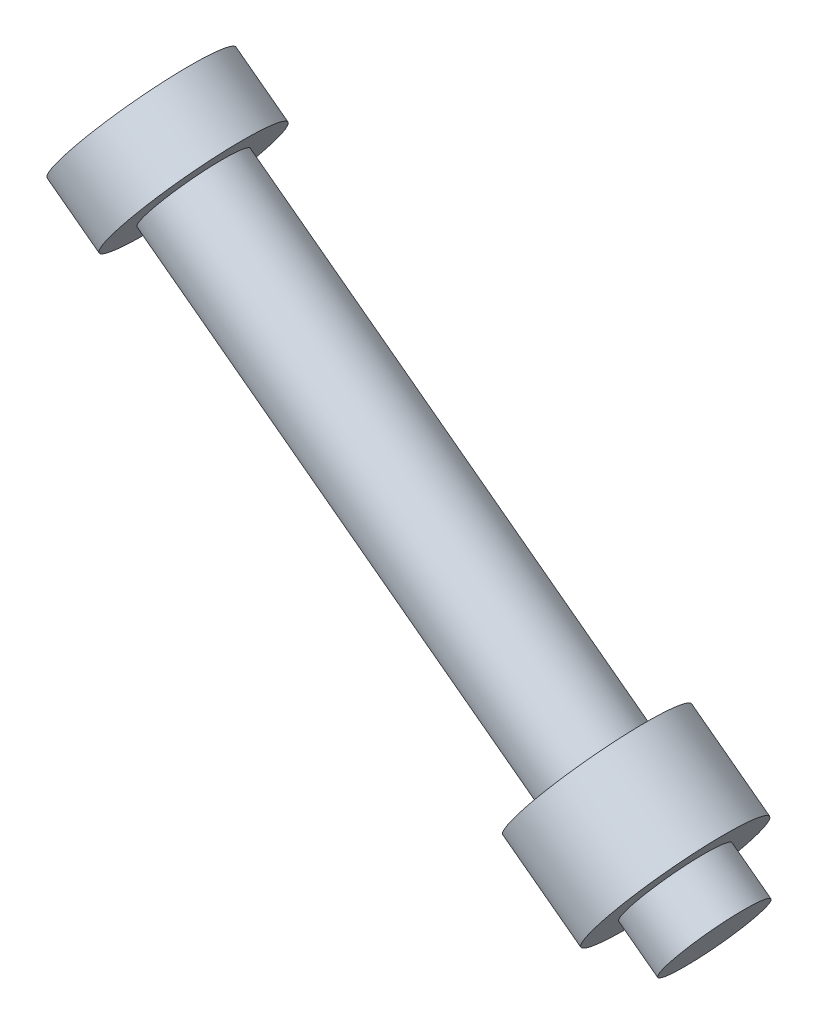
ISO-10303-21;
HEADER;
FILE_DESCRIPTION(('STEP AP214'),'2;1');
FILE_NAME('part.step','',(''),(''),'','','');
FILE_SCHEMA(('AUTOMOTIVE_DESIGN { 1 0 10303 214 1 1 1 1 }'));
ENDSEC;
DATA;
#1=APPLICATION_CONTEXT('core data for automotive mechanical design processes');
#2=APPLICATION_PROTOCOL_DEFINITION('international standard','automotive_design',2000,#1);
#3=PRODUCT_CONTEXT('',#1,'mechanical');
#4=PRODUCT('Part','Part','',(#3));
#5=PRODUCT_RELATED_PRODUCT_CATEGORY('part','',(#4));
#6=PRODUCT_DEFINITION_FORMATION('','',#4);
#7=PRODUCT_DEFINITION_CONTEXT('part definition',#1,'design');
#8=PRODUCT_DEFINITION('design','',#6,#7);
#9=PRODUCT_DEFINITION_SHAPE('','',#8);
#10=(LENGTH_UNIT() NAMED_UNIT(*) SI_UNIT(.MILLI.,.METRE.));
#11=(NAMED_UNIT(*) PLANE_ANGLE_UNIT() SI_UNIT($,.RADIAN.));
#12=(NAMED_UNIT(*) SI_UNIT($,.STERADIAN.) SOLID_ANGLE_UNIT());
#13=UNCERTAINTY_MEASURE_WITH_UNIT(LENGTH_MEASURE(1.E-05),#10,'distance_accuracy_value','');
#14=(GEOMETRIC_REPRESENTATION_CONTEXT(3) GLOBAL_UNCERTAINTY_ASSIGNED_CONTEXT((#13)) GLOBAL_UNIT_ASSIGNED_CONTEXT((#10,
#11,#12)) REPRESENTATION_CONTEXT('',''));
#15=CARTESIAN_POINT('',(0.,0.,0.));
#16=DIRECTION('',(0.,0.,1.));
#17=DIRECTION('',(1.,0.,0.));
#18=AXIS2_PLACEMENT_3D('',#15,#16,#17);
#19=CARTESIAN_POINT('',(-234.974862985974,359.135649616631,0.));
#20=DIRECTION('',(-0.800654275017359,0.599126640950332,0.));
#21=DIRECTION('',(-0.599126640950332,-0.800654275017359,0.));
#22=AXIS2_PLACEMENT_3D('',#19,#20,#21);
#23=PLANE('',#22);
#24=CARTESIAN_POINT('',(-234.974862985974,359.135649616631,0.));
#25=DIRECTION('',(-0.800654275017385,0.599126640950296,0.));
#26=DIRECTION('',(-0.599126640950296,-0.800654275017385,0.));
#27=AXIS2_PLACEMENT_3D('',#24,#25,#26);
#28=CIRCLE('',#27,3.);
#29=CARTESIAN_POINT('',(-236.772242908825,356.733686791579,0.));
#30=VERTEX_POINT('',#29);
#31=EDGE_CURVE('E67',#30,#30,#28,.T.);
#32=ORIENTED_EDGE('',*,*,#31,.T.);
#33=EDGE_LOOP('',(#32));
#34=FACE_BOUND('',#33,.T.);
#35=CARTESIAN_POINT('',(-234.974862985974,359.135649616631,0.));
#36=DIRECTION('',(-0.800654275017359,0.599126640950332,0.));
#37=DIRECTION('',(-0.599126640950332,-0.800654275017359,0.));
#38=AXIS2_PLACEMENT_3D('',#35,#36,#37);
#39=CIRCLE('',#38,5.);
#40=CARTESIAN_POINT('',(-237.970496190725,355.132378241545,0.));
#41=VERTEX_POINT('',#40);
#42=EDGE_CURVE('E62',#41,#41,#39,.T.);
#43=ORIENTED_EDGE('',*,*,#42,.F.);
#44=EDGE_LOOP('',(#43));
#45=FACE_BOUND('',#44,.T.);
#46=ADVANCED_FACE('F51',(#34,#45),#23,.F.);
#47=CARTESIAN_POINT('',(-238.177480086043,361.532156180433,0.));
#48=DIRECTION('',(-0.800654275017359,0.599126640950332,0.));
#49=DIRECTION('',(-0.599126640950332,-0.800654275017359,0.));
#50=AXIS2_PLACEMENT_3D('',#47,#48,#49);
#51=PLANE('',#50);
#52=CARTESIAN_POINT('',(-238.177480086043,361.532156180433,0.));
#53=DIRECTION('',(-0.800654275017359,0.599126640950332,0.));
#54=DIRECTION('',(-0.599126640950332,-0.800654275017359,0.));
#55=AXIS2_PLACEMENT_3D('',#52,#53,#54);
#56=CIRCLE('',#55,5.);
#57=CARTESIAN_POINT('',(-241.173113290795,357.528884805346,0.));
#58=VERTEX_POINT('',#57);
#59=EDGE_CURVE('E58',#58,#58,#56,.T.);
#60=ORIENTED_EDGE('',*,*,#59,.T.);
#61=EDGE_LOOP('',(#60));
#62=FACE_BOUND('',#61,.T.);
#63=ADVANCED_FACE('F103',(#62),#51,.T.);
#64=CARTESIAN_POINT('',(-234.974862985974,359.135649616631,0.));
#65=DIRECTION('',(-0.800654275017377,0.599126640950308,0.));
#66=DIRECTION('',(-0.599126640950308,-0.800654275017377,0.));
#67=AXIS2_PLACEMENT_3D('',#64,#65,#66);
#68=CYLINDRICAL_SURFACE('',#67,5.);
#69=ORIENTED_EDGE('',*,*,#59,.F.);
#70=EDGE_LOOP('',(#69));
#71=FACE_BOUND('',#70,.T.);
#72=ORIENTED_EDGE('',*,*,#42,.T.);
#73=EDGE_LOOP('',(#72));
#74=FACE_BOUND('',#73,.T.);
#75=ADVANCED_FACE('F94',(#71,#74),#68,.T.);
#76=CARTESIAN_POINT('',(-202.948691985278,335.17058397862,0.));
#77=DIRECTION('',(-0.800654275017385,0.599126640950297,0.));
#78=DIRECTION('',(-0.599126640950297,-0.800654275017385,0.));
#79=AXIS2_PLACEMENT_3D('',#76,#77,#78);
#80=CYLINDRICAL_SURFACE('',#79,3.);
#81=CARTESIAN_POINT('',(-210.154580460435,340.562723747172,0.));
#82=DIRECTION('',(-0.800654275017388,0.599126640950293,0.));
#83=DIRECTION('',(-0.599126640950293,-0.800654275017388,0.));
#84=AXIS2_PLACEMENT_3D('',#81,#82,#83);
#85=CIRCLE('',#84,3.);
#86=CARTESIAN_POINT('',(-211.951960383286,338.16076092212,0.));
#87=VERTEX_POINT('',#86);
#88=EDGE_CURVE('E11',#87,#87,#85,.F.);
#89=ORIENTED_EDGE('',*,*,#88,.F.);
#90=EDGE_LOOP('',(#89));
#91=FACE_BOUND('',#90,.T.);
#92=ORIENTED_EDGE('',*,*,#31,.F.);
#93=EDGE_LOOP('',(#92));
#94=FACE_BOUND('',#93,.T.);
#95=ADVANCED_FACE('F85',(#91,#94),#80,.T.);
#96=CARTESIAN_POINT('',(-205.350654810331,336.967963901471,0.));
#97=DIRECTION('',(-0.800654275017388,0.599126640950293,0.));
#98=DIRECTION('',(-0.599126640950293,-0.800654275017388,0.));
#99=AXIS2_PLACEMENT_3D('',#96,#97,#98);
#100=PLANE('',#99);
#101=CARTESIAN_POINT('',(-205.350654810331,336.96796390147,0.));
#102=DIRECTION('',(-0.800654275017388,0.599126640950293,0.));
#103=DIRECTION('',(-0.599126640950293,-0.800654275017388,0.));
#104=AXIS2_PLACEMENT_3D('',#101,#102,#103);
#105=CIRCLE('',#104,3.);
#106=CARTESIAN_POINT('',(-207.148034733182,334.566001076418,0.));
#107=VERTEX_POINT('',#106);
#108=EDGE_CURVE('E54',#107,#107,#105,.F.);
#109=ORIENTED_EDGE('',*,*,#108,.F.);
#110=EDGE_LOOP('',(#109));
#111=FACE_BOUND('',#110,.T.);
#112=CARTESIAN_POINT('',(-205.350654810331,336.967963901471,0.));
#113=DIRECTION('',(-0.800654275017388,0.599126640950293,0.));
#114=DIRECTION('',(-0.599126640950293,-0.800654275017388,0.));
#115=AXIS2_PLACEMENT_3D('',#112,#113,#114);
#116=CIRCLE('',#115,5.);
#117=CARTESIAN_POINT('',(-208.346288015082,332.964692526384,0.));
#118=VERTEX_POINT('',#117);
#119=EDGE_CURVE('E76',#118,#118,#116,.T.);
#120=ORIENTED_EDGE('',*,*,#119,.F.);
#121=EDGE_LOOP('',(#120));
#122=FACE_BOUND('',#121,.T.);
#123=ADVANCED_FACE('F82',(#111,#122),#100,.F.);
#124=CARTESIAN_POINT('',(-210.154580460435,340.562723747172,0.));
#125=DIRECTION('',(-0.800654275017388,0.599126640950293,0.));
#126=DIRECTION('',(-0.599126640950293,-0.800654275017388,0.));
#127=AXIS2_PLACEMENT_3D('',#124,#125,#126);
#128=PLANE('',#127);
#129=ORIENTED_EDGE('',*,*,#88,.T.);
#130=EDGE_LOOP('',(#129));
#131=FACE_BOUND('',#130,.T.);
#132=CARTESIAN_POINT('',(-210.154580460435,340.562723747172,0.));
#133=DIRECTION('',(-0.800654275017388,0.599126640950293,0.));
#134=DIRECTION('',(-0.599126640950293,-0.800654275017388,0.));
#135=AXIS2_PLACEMENT_3D('',#132,#133,#134);
#136=CIRCLE('',#135,5.);
#137=CARTESIAN_POINT('',(-213.150213665186,336.559452372085,0.));
#138=VERTEX_POINT('',#137);
#139=EDGE_CURVE('E73',#138,#138,#136,.T.);
#140=ORIENTED_EDGE('',*,*,#139,.T.);
#141=EDGE_LOOP('',(#140));
#142=FACE_BOUND('',#141,.T.);
#143=ADVANCED_FACE('F84',(#131,#142),#128,.T.);
#144=CARTESIAN_POINT('',(-205.350654810331,336.967963901471,0.));
#145=DIRECTION('',(-0.800654275017389,0.599126640950291,0.));
#146=DIRECTION('',(-0.599126640950291,-0.800654275017389,0.));
#147=AXIS2_PLACEMENT_3D('',#144,#145,#146);
#148=CYLINDRICAL_SURFACE('',#147,5.);
#149=ORIENTED_EDGE('',*,*,#139,.F.);
#150=EDGE_LOOP('',(#149));
#151=FACE_BOUND('',#150,.T.);
#152=ORIENTED_EDGE('',*,*,#119,.T.);
#153=EDGE_LOOP('',(#152));
#154=FACE_BOUND('',#153,.T.);
#155=ADVANCED_FACE('F80',(#151,#154),#148,.T.);
#156=CARTESIAN_POINT('',(-202.948691985278,335.17058397862,0.));
#157=DIRECTION('',(-0.800654275017385,0.599126640950296,0.));
#158=DIRECTION('',(-0.599126640950296,-0.800654275017385,0.));
#159=AXIS2_PLACEMENT_3D('',#156,#157,#158);
#160=PLANE('',#159);
#161=CARTESIAN_POINT('',(-202.948691985278,335.17058397862,0.));
#162=DIRECTION('',(-0.800654275017385,0.599126640950296,0.));
#163=DIRECTION('',(-0.599126640950296,-0.800654275017385,0.));
#164=AXIS2_PLACEMENT_3D('',#161,#162,#163);
#165=CIRCLE('',#164,3.);
#166=CARTESIAN_POINT('',(-204.746071908129,332.768621153567,0.));
#167=VERTEX_POINT('',#166);
#168=EDGE_CURVE('E70',#167,#167,#165,.T.);
#169=ORIENTED_EDGE('',*,*,#168,.F.);
#170=EDGE_LOOP('',(#169));
#171=FACE_BOUND('',#170,.T.);
#172=ADVANCED_FACE('F88',(#171),#160,.F.);
#173=ORIENTED_EDGE('',*,*,#168,.T.);
#174=EDGE_LOOP('',(#173));
#175=FACE_BOUND('',#174,.T.);
#176=ORIENTED_EDGE('',*,*,#108,.T.);
#177=EDGE_LOOP('',(#176));
#178=FACE_BOUND('',#177,.T.);
#179=ADVANCED_FACE('F97',(#175,#178),#80,.T.);
#180=CLOSED_SHELL('',(#46,#63,#75,#95,#123,#143,#155,#172,#179));
#181=MANIFOLD_SOLID_BREP('B2',#180);
#182=ADVANCED_BREP_SHAPE_REPRESENTATION('',(#18,#181),#14);
#183=SHAPE_DEFINITION_REPRESENTATION(#9,#182);
ENDSEC;
END-ISO-10303-21;
